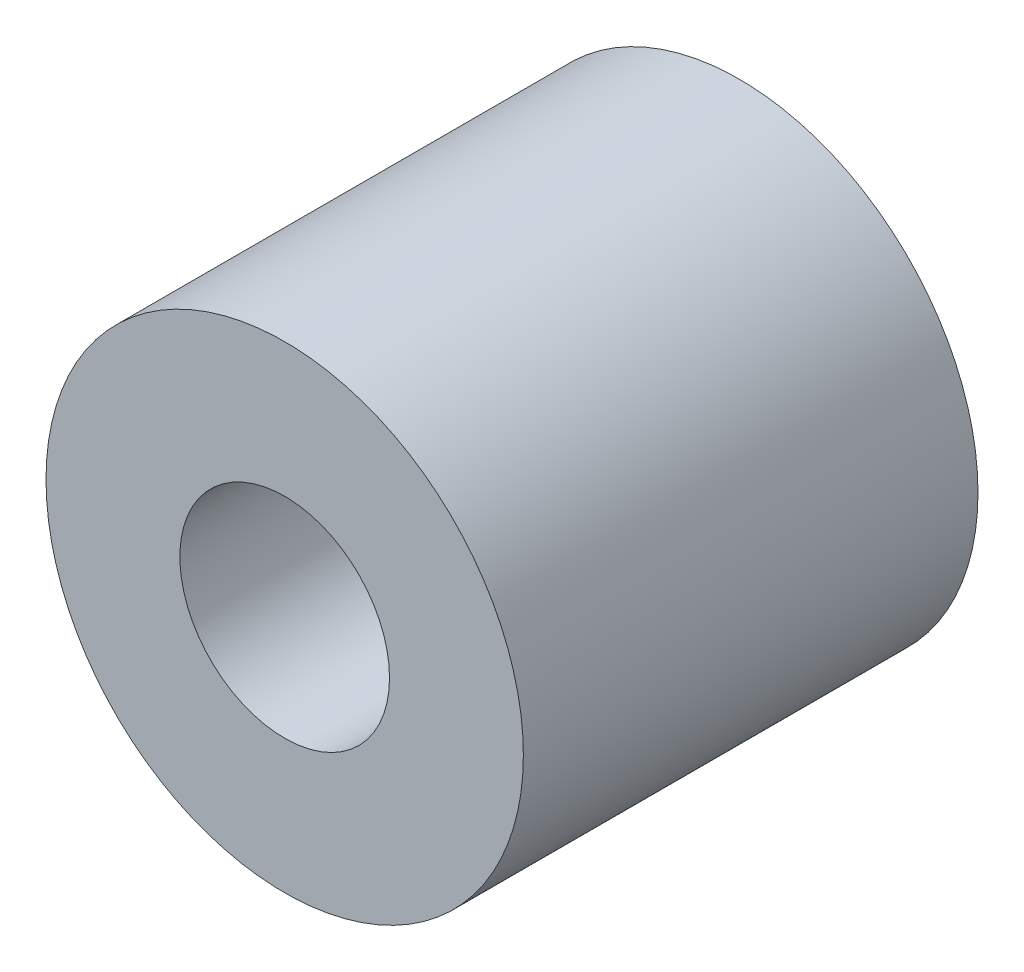
ISO-10303-21;
HEADER;
FILE_DESCRIPTION(('STEP AP214'),'2;1');
FILE_NAME('part.step','',(''),(''),'','','');
FILE_SCHEMA(('AUTOMOTIVE_DESIGN { 1 0 10303 214 1 1 1 1 }'));
ENDSEC;
DATA;
#1=APPLICATION_CONTEXT('core data for automotive mechanical design processes');
#2=APPLICATION_PROTOCOL_DEFINITION('international standard','automotive_design',2000,#1);
#3=PRODUCT_CONTEXT('',#1,'mechanical');
#4=PRODUCT('Part','Part','',(#3));
#5=PRODUCT_RELATED_PRODUCT_CATEGORY('part','',(#4));
#6=PRODUCT_DEFINITION_FORMATION('','',#4);
#7=PRODUCT_DEFINITION_CONTEXT('part definition',#1,'design');
#8=PRODUCT_DEFINITION('design','',#6,#7);
#9=PRODUCT_DEFINITION_SHAPE('','',#8);
#10=(LENGTH_UNIT() NAMED_UNIT(*) SI_UNIT(.MILLI.,.METRE.));
#11=(NAMED_UNIT(*) PLANE_ANGLE_UNIT() SI_UNIT($,.RADIAN.));
#12=(NAMED_UNIT(*) SI_UNIT($,.STERADIAN.) SOLID_ANGLE_UNIT());
#13=UNCERTAINTY_MEASURE_WITH_UNIT(LENGTH_MEASURE(1.E-05),#10,'distance_accuracy_value','');
#14=(GEOMETRIC_REPRESENTATION_CONTEXT(3) GLOBAL_UNCERTAINTY_ASSIGNED_CONTEXT((#13)) GLOBAL_UNIT_ASSIGNED_CONTEXT((#10,
#11,#12)) REPRESENTATION_CONTEXT('',''));
#15=CARTESIAN_POINT('',(0.,0.,0.));
#16=DIRECTION('',(0.,0.,1.));
#17=DIRECTION('',(1.,0.,0.));
#18=AXIS2_PLACEMENT_3D('',#15,#16,#17);
#19=CARTESIAN_POINT('',(0.,0.,18.));
#20=DIRECTION('',(0.,0.,1.));
#21=DIRECTION('',(1.,0.,0.));
#22=AXIS2_PLACEMENT_3D('',#19,#20,#21);
#23=PLANE('',#22);
#24=CARTESIAN_POINT('',(0.,0.,18.));
#25=DIRECTION('',(0.,0.,1.));
#26=DIRECTION('',(1.,0.,0.));
#27=AXIS2_PLACEMENT_3D('',#24,#25,#26);
#28=CIRCLE('',#27,9.45);
#29=CARTESIAN_POINT('',(9.45,0.,18.));
#30=VERTEX_POINT('',#29);
#31=EDGE_CURVE('E10',#30,#30,#28,.T.);
#32=ORIENTED_EDGE('',*,*,#31,.T.);
#33=EDGE_LOOP('',(#32));
#34=FACE_BOUND('',#33,.T.);
#35=CARTESIAN_POINT('',(0.,0.,18.));
#36=DIRECTION('',(0.,0.,1.));
#37=DIRECTION('',(1.,0.,0.));
#38=AXIS2_PLACEMENT_3D('',#35,#36,#37);
#39=CIRCLE('',#38,4.15);
#40=CARTESIAN_POINT('',(4.15,0.,18.));
#41=VERTEX_POINT('',#40);
#42=EDGE_CURVE('E42',#41,#41,#39,.T.);
#43=ORIENTED_EDGE('',*,*,#42,.F.);
#44=EDGE_LOOP('',(#43));
#45=FACE_BOUND('',#44,.T.);
#46=ADVANCED_FACE('F31',(#34,#45),#23,.T.);
#47=CARTESIAN_POINT('',(0.,0.,0.));
#48=DIRECTION('',(0.,0.,1.));
#49=DIRECTION('',(1.,0.,0.));
#50=AXIS2_PLACEMENT_3D('',#47,#48,#49);
#51=PLANE('',#50);
#52=CARTESIAN_POINT('',(0.,0.,0.));
#53=DIRECTION('',(0.,0.,1.));
#54=DIRECTION('',(1.,0.,0.));
#55=AXIS2_PLACEMENT_3D('',#52,#53,#54);
#56=CIRCLE('',#55,9.45);
#57=CARTESIAN_POINT('',(9.45,0.,0.));
#58=VERTEX_POINT('',#57);
#59=EDGE_CURVE('E35',#58,#58,#56,.T.);
#60=ORIENTED_EDGE('',*,*,#59,.F.);
#61=EDGE_LOOP('',(#60));
#62=FACE_BOUND('',#61,.T.);
#63=CARTESIAN_POINT('',(0.,0.,0.));
#64=DIRECTION('',(0.,0.,1.));
#65=DIRECTION('',(1.,0.,0.));
#66=AXIS2_PLACEMENT_3D('',#63,#64,#65);
#67=CIRCLE('',#66,4.15);
#68=CARTESIAN_POINT('',(4.15,0.,0.));
#69=VERTEX_POINT('',#68);
#70=EDGE_CURVE('E44',#69,#69,#67,.T.);
#71=ORIENTED_EDGE('',*,*,#70,.T.);
#72=EDGE_LOOP('',(#71));
#73=FACE_BOUND('',#72,.T.);
#74=ADVANCED_FACE('F54',(#62,#73),#51,.F.);
#75=CARTESIAN_POINT('',(0.,0.,18.));
#76=DIRECTION('',(0.,0.,-1.));
#77=DIRECTION('',(-1.,0.,0.));
#78=AXIS2_PLACEMENT_3D('',#75,#76,#77);
#79=CYLINDRICAL_SURFACE('',#78,9.45);
#80=ORIENTED_EDGE('',*,*,#31,.F.);
#81=EDGE_LOOP('',(#80));
#82=FACE_BOUND('',#81,.T.);
#83=ORIENTED_EDGE('',*,*,#59,.T.);
#84=EDGE_LOOP('',(#83));
#85=FACE_BOUND('',#84,.T.);
#86=ADVANCED_FACE('F33',(#82,#85),#79,.T.);
#87=CARTESIAN_POINT('',(0.,0.,18.));
#88=DIRECTION('',(0.,0.,-1.));
#89=DIRECTION('',(-1.,0.,0.));
#90=AXIS2_PLACEMENT_3D('',#87,#88,#89);
#91=CYLINDRICAL_SURFACE('',#90,4.15);
#92=ORIENTED_EDGE('',*,*,#42,.T.);
#93=EDGE_LOOP('',(#92));
#94=FACE_BOUND('',#93,.T.);
#95=ORIENTED_EDGE('',*,*,#70,.F.);
#96=EDGE_LOOP('',(#95));
#97=FACE_BOUND('',#96,.T.);
#98=ADVANCED_FACE('F50',(#94,#97),#91,.F.);
#99=CLOSED_SHELL('',(#46,#74,#86,#98));
#100=MANIFOLD_SOLID_BREP('B2',#99);
#101=ADVANCED_BREP_SHAPE_REPRESENTATION('',(#18,#100),#14);
#102=SHAPE_DEFINITION_REPRESENTATION(#9,#101);
ENDSEC;
END-ISO-10303-21;
